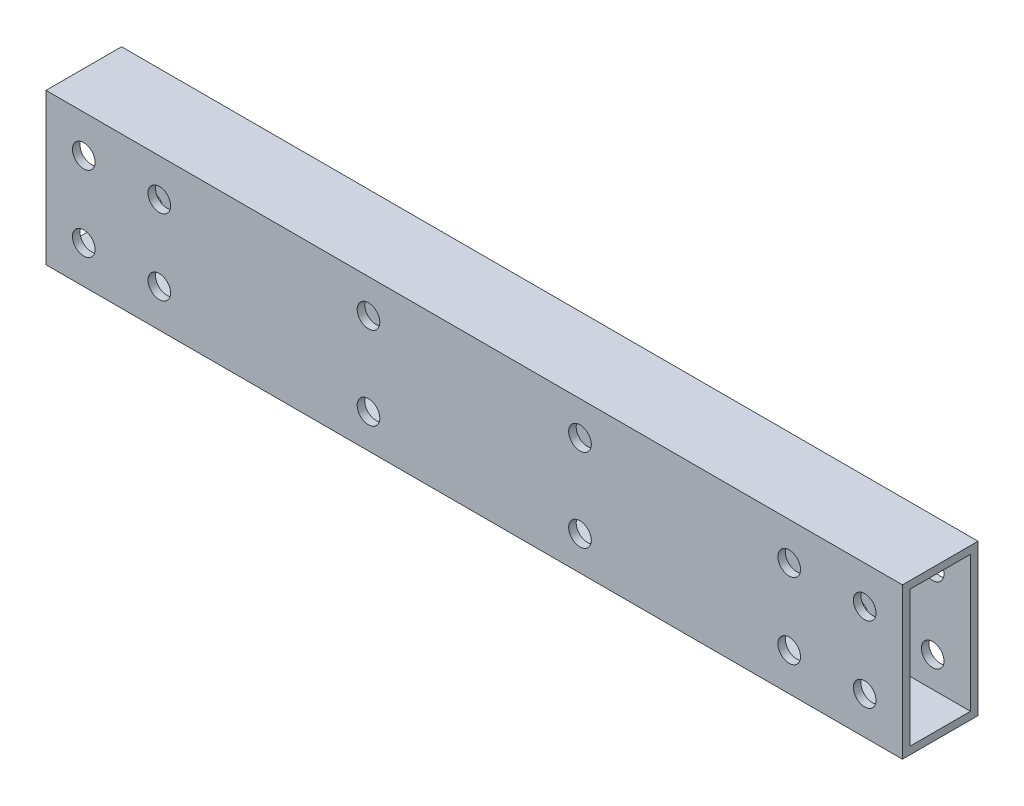
ISO-10303-21;
HEADER;
FILE_DESCRIPTION(('STEP AP214'),'2;1');
FILE_NAME('part.step','',(''),(''),'','','');
FILE_SCHEMA(('AUTOMOTIVE_DESIGN { 1 0 10303 214 1 1 1 1 }'));
ENDSEC;
DATA;
#1=APPLICATION_CONTEXT('core data for automotive mechanical design processes');
#2=APPLICATION_PROTOCOL_DEFINITION('international standard','automotive_design',2000,#1);
#3=PRODUCT_CONTEXT('',#1,'mechanical');
#4=PRODUCT('Part','Part','',(#3));
#5=PRODUCT_RELATED_PRODUCT_CATEGORY('part','',(#4));
#6=PRODUCT_DEFINITION_FORMATION('','',#4);
#7=PRODUCT_DEFINITION_CONTEXT('part definition',#1,'design');
#8=PRODUCT_DEFINITION('design','',#6,#7);
#9=PRODUCT_DEFINITION_SHAPE('','',#8);
#10=(LENGTH_UNIT() NAMED_UNIT(*) SI_UNIT(.MILLI.,.METRE.));
#11=(NAMED_UNIT(*) PLANE_ANGLE_UNIT() SI_UNIT($,.RADIAN.));
#12=(NAMED_UNIT(*) SI_UNIT($,.STERADIAN.) SOLID_ANGLE_UNIT());
#13=UNCERTAINTY_MEASURE_WITH_UNIT(LENGTH_MEASURE(1.E-05),#10,'distance_accuracy_value','');
#14=(GEOMETRIC_REPRESENTATION_CONTEXT(3) GLOBAL_UNCERTAINTY_ASSIGNED_CONTEXT((#13)) GLOBAL_UNIT_ASSIGNED_CONTEXT((#10,
#11,#12)) REPRESENTATION_CONTEXT('',''));
#15=CARTESIAN_POINT('',(0.,0.,0.));
#16=DIRECTION('',(0.,0.,1.));
#17=DIRECTION('',(1.,0.,0.));
#18=AXIS2_PLACEMENT_3D('',#15,#16,#17);
#19=CARTESIAN_POINT('',(113.4,-10.,-5.));
#20=DIRECTION('',(0.,1.,0.));
#21=DIRECTION('',(0.,0.,1.));
#22=AXIS2_PLACEMENT_3D('',#19,#20,#21);
#23=PLANE('',#22);
#24=DIRECTION('',(0.,0.,-1.));
#25=VECTOR('',#24,1.);
#26=CARTESIAN_POINT('',(0.,-10.,-5.));
#27=LINE('',#26,#25);
#28=CARTESIAN_POINT('',(0.,-10.,5.));
#29=VERTEX_POINT('',#28);
#30=CARTESIAN_POINT('',(0.,-10.,-5.));
#31=VERTEX_POINT('',#30);
#32=EDGE_CURVE('E160',#29,#31,#27,.T.);
#33=ORIENTED_EDGE('',*,*,#32,.T.);
#34=DIRECTION('',(-1.,0.,0.));
#35=VECTOR('',#34,1.);
#36=CARTESIAN_POINT('',(113.4,-10.,-5.));
#37=LINE('',#36,#35);
#38=CARTESIAN_POINT('',(113.4,-10.,-5.));
#39=VERTEX_POINT('',#38);
#40=EDGE_CURVE('E12',#39,#31,#37,.T.);
#41=ORIENTED_EDGE('',*,*,#40,.F.);
#42=DIRECTION('',(0.,0.,-1.));
#43=VECTOR('',#42,1.);
#44=CARTESIAN_POINT('',(113.4,-10.,-5.));
#45=LINE('',#44,#43);
#46=CARTESIAN_POINT('',(113.4,-10.,5.));
#47=VERTEX_POINT('',#46);
#48=EDGE_CURVE('E133',#47,#39,#45,.T.);
#49=ORIENTED_EDGE('',*,*,#48,.F.);
#50=DIRECTION('',(-1.,0.,0.));
#51=VECTOR('',#50,1.);
#52=CARTESIAN_POINT('',(113.4,-10.,5.));
#53=LINE('',#52,#51);
#54=EDGE_CURVE('E167',#47,#29,#53,.T.);
#55=ORIENTED_EDGE('',*,*,#54,.T.);
#56=EDGE_LOOP('',(#33,#41,#49,#55));
#57=FACE_BOUND('',#56,.T.);
#58=ADVANCED_FACE('F52',(#57),#23,.F.);
#59=CARTESIAN_POINT('',(113.4,10.,-5.));
#60=DIRECTION('',(0.,0.,1.));
#61=DIRECTION('',(1.,0.,0.));
#62=AXIS2_PLACEMENT_3D('',#59,#60,#61);
#63=PLANE('',#62);
#64=CARTESIAN_POINT('',(42.7,-5.5,-5.));
#65=DIRECTION('',(0.,0.,1.));
#66=DIRECTION('',(-1.,0.,0.));
#67=AXIS2_PLACEMENT_3D('',#64,#65,#66);
#68=CIRCLE('',#67,1.49999999999998);
#69=CARTESIAN_POINT('',(41.2,-5.5,-5.));
#70=VERTEX_POINT('',#69);
#71=EDGE_CURVE('E329',#70,#70,#68,.T.);
#72=ORIENTED_EDGE('',*,*,#71,.T.);
#73=EDGE_LOOP('',(#72));
#74=FACE_BOUND('',#73,.T.);
#75=CARTESIAN_POINT('',(70.7,-5.5,-5.));
#76=DIRECTION('',(0.,0.,1.));
#77=DIRECTION('',(1.,0.,0.));
#78=AXIS2_PLACEMENT_3D('',#75,#76,#77);
#79=CIRCLE('',#78,1.50000000000005);
#80=CARTESIAN_POINT('',(72.2000000000001,-5.5,-5.));
#81=VERTEX_POINT('',#80);
#82=EDGE_CURVE('E335',#81,#81,#79,.T.);
#83=ORIENTED_EDGE('',*,*,#82,.T.);
#84=EDGE_LOOP('',(#83));
#85=FACE_BOUND('',#84,.T.);
#86=CARTESIAN_POINT('',(70.7,5.5,-5.));
#87=DIRECTION('',(0.,0.,1.));
#88=DIRECTION('',(-1.,0.,0.));
#89=AXIS2_PLACEMENT_3D('',#86,#87,#88);
#90=CIRCLE('',#89,1.5);
#91=CARTESIAN_POINT('',(69.2,5.5,-5.));
#92=VERTEX_POINT('',#91);
#93=EDGE_CURVE('E323',#92,#92,#90,.T.);
#94=ORIENTED_EDGE('',*,*,#93,.T.);
#95=EDGE_LOOP('',(#94));
#96=FACE_BOUND('',#95,.T.);
#97=CARTESIAN_POINT('',(42.7,5.5,-5.));
#98=DIRECTION('',(0.,0.,1.));
#99=DIRECTION('',(1.,0.,0.));
#100=AXIS2_PLACEMENT_3D('',#97,#98,#99);
#101=CIRCLE('',#100,1.5);
#102=CARTESIAN_POINT('',(44.2,5.5,-5.));
#103=VERTEX_POINT('',#102);
#104=EDGE_CURVE('E319',#103,#103,#101,.T.);
#105=ORIENTED_EDGE('',*,*,#104,.T.);
#106=EDGE_LOOP('',(#105));
#107=FACE_BOUND('',#106,.T.);
#108=CARTESIAN_POINT('',(108.4,-5.,-5.));
#109=DIRECTION('',(0.,0.,1.));
#110=DIRECTION('',(1.,0.,0.));
#111=AXIS2_PLACEMENT_3D('',#108,#109,#110);
#112=CIRCLE('',#111,1.50000000000001);
#113=CARTESIAN_POINT('',(109.9,-5.,-5.));
#114=VERTEX_POINT('',#113);
#115=EDGE_CURVE('E269',#114,#114,#112,.T.);
#116=ORIENTED_EDGE('',*,*,#115,.T.);
#117=EDGE_LOOP('',(#116));
#118=FACE_BOUND('',#117,.T.);
#119=CARTESIAN_POINT('',(5.,-5.,-5.));
#120=DIRECTION('',(0.,0.,1.));
#121=DIRECTION('',(1.,0.,0.));
#122=AXIS2_PLACEMENT_3D('',#119,#120,#121);
#123=CIRCLE('',#122,1.5);
#124=CARTESIAN_POINT('',(6.5,-5.,-5.));
#125=VERTEX_POINT('',#124);
#126=EDGE_CURVE('E258',#125,#125,#123,.T.);
#127=ORIENTED_EDGE('',*,*,#126,.T.);
#128=EDGE_LOOP('',(#127));
#129=FACE_BOUND('',#128,.T.);
#130=CARTESIAN_POINT('',(15.,-5.,-5.));
#131=DIRECTION('',(0.,0.,1.));
#132=DIRECTION('',(1.,0.,0.));
#133=AXIS2_PLACEMENT_3D('',#130,#131,#132);
#134=CIRCLE('',#133,1.5);
#135=CARTESIAN_POINT('',(16.5,-5.,-5.));
#136=VERTEX_POINT('',#135);
#137=EDGE_CURVE('E257',#136,#136,#134,.T.);
#138=ORIENTED_EDGE('',*,*,#137,.T.);
#139=EDGE_LOOP('',(#138));
#140=FACE_BOUND('',#139,.T.);
#141=CARTESIAN_POINT('',(5.,5.,-5.));
#142=DIRECTION('',(0.,0.,1.));
#143=DIRECTION('',(1.,0.,0.));
#144=AXIS2_PLACEMENT_3D('',#141,#142,#143);
#145=CIRCLE('',#144,1.5);
#146=CARTESIAN_POINT('',(6.5,5.,-5.));
#147=VERTEX_POINT('',#146);
#148=EDGE_CURVE('E251',#147,#147,#145,.T.);
#149=ORIENTED_EDGE('',*,*,#148,.T.);
#150=EDGE_LOOP('',(#149));
#151=FACE_BOUND('',#150,.T.);
#152=CARTESIAN_POINT('',(108.4,5.,-5.));
#153=DIRECTION('',(0.,0.,1.));
#154=DIRECTION('',(1.,0.,0.));
#155=AXIS2_PLACEMENT_3D('',#152,#153,#154);
#156=CIRCLE('',#155,1.50000000000001);
#157=CARTESIAN_POINT('',(109.9,5.,-5.));
#158=VERTEX_POINT('',#157);
#159=EDGE_CURVE('E270',#158,#158,#156,.T.);
#160=ORIENTED_EDGE('',*,*,#159,.T.);
#161=EDGE_LOOP('',(#160));
#162=FACE_BOUND('',#161,.T.);
#163=CARTESIAN_POINT('',(98.4,5.,-5.));
#164=DIRECTION('',(0.,0.,1.));
#165=DIRECTION('',(1.,0.,0.));
#166=AXIS2_PLACEMENT_3D('',#163,#164,#165);
#167=CIRCLE('',#166,1.5);
#168=CARTESIAN_POINT('',(99.9,5.,-5.));
#169=VERTEX_POINT('',#168);
#170=EDGE_CURVE('E288',#169,#169,#167,.T.);
#171=ORIENTED_EDGE('',*,*,#170,.T.);
#172=EDGE_LOOP('',(#171));
#173=FACE_BOUND('',#172,.T.);
#174=CARTESIAN_POINT('',(98.4,-5.,-5.));
#175=DIRECTION('',(0.,0.,1.));
#176=DIRECTION('',(1.,0.,0.));
#177=AXIS2_PLACEMENT_3D('',#174,#175,#176);
#178=CIRCLE('',#177,1.5);
#179=CARTESIAN_POINT('',(99.9,-5.,-5.));
#180=VERTEX_POINT('',#179);
#181=EDGE_CURVE('E281',#180,#180,#178,.T.);
#182=ORIENTED_EDGE('',*,*,#181,.T.);
#183=EDGE_LOOP('',(#182));
#184=FACE_BOUND('',#183,.T.);
#185=CARTESIAN_POINT('',(15.,5.,-5.));
#186=DIRECTION('',(0.,0.,1.));
#187=DIRECTION('',(1.,0.,0.));
#188=AXIS2_PLACEMENT_3D('',#185,#186,#187);
#189=CIRCLE('',#188,1.5);
#190=CARTESIAN_POINT('',(16.5,5.,-5.));
#191=VERTEX_POINT('',#190);
#192=EDGE_CURVE('E247',#191,#191,#189,.T.);
#193=ORIENTED_EDGE('',*,*,#192,.T.);
#194=EDGE_LOOP('',(#193));
#195=FACE_BOUND('',#194,.T.);
#196=DIRECTION('',(0.,1.,0.));
#197=VECTOR('',#196,1.);
#198=CARTESIAN_POINT('',(0.,10.,-5.));
#199=LINE('',#198,#197);
#200=CARTESIAN_POINT('',(0.,10.,-5.));
#201=VERTEX_POINT('',#200);
#202=EDGE_CURVE('E138',#31,#201,#199,.T.);
#203=ORIENTED_EDGE('',*,*,#202,.T.);
#204=DIRECTION('',(-1.,0.,0.));
#205=VECTOR('',#204,1.);
#206=CARTESIAN_POINT('',(113.4,10.,-5.));
#207=LINE('',#206,#205);
#208=CARTESIAN_POINT('',(113.4,10.,-5.));
#209=VERTEX_POINT('',#208);
#210=EDGE_CURVE('E62',#209,#201,#207,.T.);
#211=ORIENTED_EDGE('',*,*,#210,.F.);
#212=DIRECTION('',(0.,1.,0.));
#213=VECTOR('',#212,1.);
#214=CARTESIAN_POINT('',(113.4,10.,-5.));
#215=LINE('',#214,#213);
#216=EDGE_CURVE('E127',#39,#209,#215,.T.);
#217=ORIENTED_EDGE('',*,*,#216,.F.);
#218=ORIENTED_EDGE('',*,*,#40,.T.);
#219=EDGE_LOOP('',(#203,#211,#217,#218));
#220=FACE_BOUND('',#219,.T.);
#221=ADVANCED_FACE('F137',(#74,#85,#96,#107,#118,#129,#140,#151,#162,#173,#184,#195,#220),#63,.F.);
#222=CARTESIAN_POINT('',(113.4,10.,-5.));
#223=DIRECTION('',(0.,-1.,0.));
#224=DIRECTION('',(0.,0.,-1.));
#225=AXIS2_PLACEMENT_3D('',#222,#223,#224);
#226=PLANE('',#225);
#227=DIRECTION('',(0.,0.,1.));
#228=VECTOR('',#227,1.);
#229=CARTESIAN_POINT('',(0.,10.,-5.));
#230=LINE('',#229,#228);
#231=CARTESIAN_POINT('',(0.,10.,5.));
#232=VERTEX_POINT('',#231);
#233=EDGE_CURVE('E100',#201,#232,#230,.T.);
#234=ORIENTED_EDGE('',*,*,#233,.T.);
#235=DIRECTION('',(-1.,0.,0.));
#236=VECTOR('',#235,1.);
#237=CARTESIAN_POINT('',(113.4,10.,5.));
#238=LINE('',#237,#236);
#239=CARTESIAN_POINT('',(113.4,10.,5.));
#240=VERTEX_POINT('',#239);
#241=EDGE_CURVE('E139',#240,#232,#238,.T.);
#242=ORIENTED_EDGE('',*,*,#241,.F.);
#243=DIRECTION('',(0.,0.,1.));
#244=VECTOR('',#243,1.);
#245=CARTESIAN_POINT('',(113.4,10.,-5.));
#246=LINE('',#245,#244);
#247=EDGE_CURVE('E131',#209,#240,#246,.T.);
#248=ORIENTED_EDGE('',*,*,#247,.F.);
#249=ORIENTED_EDGE('',*,*,#210,.T.);
#250=EDGE_LOOP('',(#234,#242,#248,#249));
#251=FACE_BOUND('',#250,.T.);
#252=ADVANCED_FACE('F141',(#251),#226,.F.);
#253=CARTESIAN_POINT('',(113.4,-8.99999999999999,-4.00000000000001));
#254=DIRECTION('',(0.,1.,0.));
#255=DIRECTION('',(0.,0.,1.));
#256=AXIS2_PLACEMENT_3D('',#253,#254,#255);
#257=PLANE('',#256);
#258=DIRECTION('',(0.,0.,-1.));
#259=VECTOR('',#258,1.);
#260=CARTESIAN_POINT('',(0.,-8.99999999999999,-4.00000000000001));
#261=LINE('',#260,#259);
#262=CARTESIAN_POINT('',(0.,-9.,3.99999999999999));
#263=VERTEX_POINT('',#262);
#264=CARTESIAN_POINT('',(0.,-8.99999999999999,-4.00000000000001));
#265=VERTEX_POINT('',#264);
#266=EDGE_CURVE('E147',#263,#265,#261,.T.);
#267=ORIENTED_EDGE('',*,*,#266,.F.);
#268=DIRECTION('',(-1.,0.,0.));
#269=VECTOR('',#268,1.);
#270=CARTESIAN_POINT('',(113.4,-9.,3.99999999999999));
#271=LINE('',#270,#269);
#272=CARTESIAN_POINT('',(113.4,-9.,3.99999999999999));
#273=VERTEX_POINT('',#272);
#274=EDGE_CURVE('E56',#273,#263,#271,.T.);
#275=ORIENTED_EDGE('',*,*,#274,.F.);
#276=DIRECTION('',(0.,0.,-1.));
#277=VECTOR('',#276,1.);
#278=CARTESIAN_POINT('',(113.4,-8.99999999999999,-4.00000000000001));
#279=LINE('',#278,#277);
#280=CARTESIAN_POINT('',(113.4,-8.99999999999999,-4.00000000000001));
#281=VERTEX_POINT('',#280);
#282=EDGE_CURVE('E166',#273,#281,#279,.T.);
#283=ORIENTED_EDGE('',*,*,#282,.T.);
#284=DIRECTION('',(-1.,0.,0.));
#285=VECTOR('',#284,1.);
#286=CARTESIAN_POINT('',(113.4,-8.99999999999999,-4.00000000000001));
#287=LINE('',#286,#285);
#288=EDGE_CURVE('E143',#281,#265,#287,.T.);
#289=ORIENTED_EDGE('',*,*,#288,.T.);
#290=EDGE_LOOP('',(#267,#275,#283,#289));
#291=FACE_BOUND('',#290,.T.);
#292=ADVANCED_FACE('F54',(#291),#257,.T.);
#293=CARTESIAN_POINT('',(113.4,9.,4.));
#294=DIRECTION('',(0.,0.,-1.));
#295=DIRECTION('',(0.,1.,0.));
#296=AXIS2_PLACEMENT_3D('',#293,#294,#295);
#297=PLANE('',#296);
#298=CARTESIAN_POINT('',(42.7,-5.5,3.99999999999999));
#299=DIRECTION('',(0.,0.,-1.));
#300=DIRECTION('',(0.,1.,0.));
#301=AXIS2_PLACEMENT_3D('',#298,#299,#300);
#302=CIRCLE('',#301,1.49999999999998);
#303=CARTESIAN_POINT('',(42.7,-4.00000000000002,3.99999999999999));
#304=VERTEX_POINT('',#303);
#305=EDGE_CURVE('E282',#304,#304,#302,.T.);
#306=ORIENTED_EDGE('',*,*,#305,.F.);
#307=EDGE_LOOP('',(#306));
#308=FACE_BOUND('',#307,.T.);
#309=CARTESIAN_POINT('',(70.7,-5.5,3.99999999999999));
#310=DIRECTION('',(0.,0.,-1.));
#311=DIRECTION('',(0.,1.,0.));
#312=AXIS2_PLACEMENT_3D('',#309,#310,#311);
#313=CIRCLE('',#312,1.50000000000005);
#314=CARTESIAN_POINT('',(70.7,-3.99999999999995,3.99999999999999));
#315=VERTEX_POINT('',#314);
#316=EDGE_CURVE('E301',#315,#315,#313,.T.);
#317=ORIENTED_EDGE('',*,*,#316,.F.);
#318=EDGE_LOOP('',(#317));
#319=FACE_BOUND('',#318,.T.);
#320=CARTESIAN_POINT('',(70.7,5.5,4.));
#321=DIRECTION('',(0.,0.,-1.));
#322=DIRECTION('',(0.,1.,0.));
#323=AXIS2_PLACEMENT_3D('',#320,#321,#322);
#324=CIRCLE('',#323,1.5);
#325=CARTESIAN_POINT('',(70.7,7.,4.));
#326=VERTEX_POINT('',#325);
#327=EDGE_CURVE('E307',#326,#326,#324,.T.);
#328=ORIENTED_EDGE('',*,*,#327,.F.);
#329=EDGE_LOOP('',(#328));
#330=FACE_BOUND('',#329,.T.);
#331=CARTESIAN_POINT('',(42.7,5.5,4.));
#332=DIRECTION('',(0.,0.,-1.));
#333=DIRECTION('',(0.,1.,0.));
#334=AXIS2_PLACEMENT_3D('',#331,#332,#333);
#335=CIRCLE('',#334,1.5);
#336=CARTESIAN_POINT('',(42.7,7.,4.));
#337=VERTEX_POINT('',#336);
#338=EDGE_CURVE('E313',#337,#337,#335,.T.);
#339=ORIENTED_EDGE('',*,*,#338,.F.);
#340=EDGE_LOOP('',(#339));
#341=FACE_BOUND('',#340,.T.);
#342=CARTESIAN_POINT('',(108.4,-5.,3.99999999999999));
#343=DIRECTION('',(0.,0.,-1.));
#344=DIRECTION('',(0.,1.,0.));
#345=AXIS2_PLACEMENT_3D('',#342,#343,#344);
#346=CIRCLE('',#345,1.50000000000001);
#347=CARTESIAN_POINT('',(108.4,-3.49999999999999,3.99999999999999));
#348=VERTEX_POINT('',#347);
#349=EDGE_CURVE('E151',#348,#348,#346,.T.);
#350=ORIENTED_EDGE('',*,*,#349,.F.);
#351=EDGE_LOOP('',(#350));
#352=FACE_BOUND('',#351,.T.);
#353=CARTESIAN_POINT('',(5.,-5.,3.99999999999999));
#354=DIRECTION('',(0.,0.,-1.));
#355=DIRECTION('',(0.,1.,0.));
#356=AXIS2_PLACEMENT_3D('',#353,#354,#355);
#357=CIRCLE('',#356,1.5);
#358=CARTESIAN_POINT('',(5.,-3.5,3.99999999999999));
#359=VERTEX_POINT('',#358);
#360=EDGE_CURVE('E205',#359,#359,#357,.T.);
#361=ORIENTED_EDGE('',*,*,#360,.F.);
#362=EDGE_LOOP('',(#361));
#363=FACE_BOUND('',#362,.T.);
#364=CARTESIAN_POINT('',(15.,-5.,3.99999999999999));
#365=DIRECTION('',(0.,0.,-1.));
#366=DIRECTION('',(0.,1.,0.));
#367=AXIS2_PLACEMENT_3D('',#364,#365,#366);
#368=CIRCLE('',#367,1.5);
#369=CARTESIAN_POINT('',(15.,-3.5,3.99999999999999));
#370=VERTEX_POINT('',#369);
#371=EDGE_CURVE('E211',#370,#370,#368,.T.);
#372=ORIENTED_EDGE('',*,*,#371,.F.);
#373=EDGE_LOOP('',(#372));
#374=FACE_BOUND('',#373,.T.);
#375=CARTESIAN_POINT('',(5.,5.,4.));
#376=DIRECTION('',(0.,0.,-1.));
#377=DIRECTION('',(0.,1.,0.));
#378=AXIS2_PLACEMENT_3D('',#375,#376,#377);
#379=CIRCLE('',#378,1.5);
#380=CARTESIAN_POINT('',(5.,6.5,4.));
#381=VERTEX_POINT('',#380);
#382=EDGE_CURVE('E217',#381,#381,#379,.T.);
#383=ORIENTED_EDGE('',*,*,#382,.F.);
#384=EDGE_LOOP('',(#383));
#385=FACE_BOUND('',#384,.T.);
#386=CARTESIAN_POINT('',(108.4,5.,4.));
#387=DIRECTION('',(0.,0.,-1.));
#388=DIRECTION('',(0.,1.,0.));
#389=AXIS2_PLACEMENT_3D('',#386,#387,#388);
#390=CIRCLE('',#389,1.50000000000001);
#391=CARTESIAN_POINT('',(108.4,6.50000000000001,4.));
#392=VERTEX_POINT('',#391);
#393=EDGE_CURVE('E223',#392,#392,#390,.T.);
#394=ORIENTED_EDGE('',*,*,#393,.F.);
#395=EDGE_LOOP('',(#394));
#396=FACE_BOUND('',#395,.T.);
#397=CARTESIAN_POINT('',(98.4,5.,4.));
#398=DIRECTION('',(0.,0.,-1.));
#399=DIRECTION('',(0.,1.,0.));
#400=AXIS2_PLACEMENT_3D('',#397,#398,#399);
#401=CIRCLE('',#400,1.5);
#402=CARTESIAN_POINT('',(98.4,6.5,4.));
#403=VERTEX_POINT('',#402);
#404=EDGE_CURVE('E229',#403,#403,#401,.T.);
#405=ORIENTED_EDGE('',*,*,#404,.F.);
#406=EDGE_LOOP('',(#405));
#407=FACE_BOUND('',#406,.T.);
#408=CARTESIAN_POINT('',(98.4,-5.,3.99999999999999));
#409=DIRECTION('',(0.,0.,-1.));
#410=DIRECTION('',(0.,1.,0.));
#411=AXIS2_PLACEMENT_3D('',#408,#409,#410);
#412=CIRCLE('',#411,1.5);
#413=CARTESIAN_POINT('',(98.4,-3.5,3.99999999999999));
#414=VERTEX_POINT('',#413);
#415=EDGE_CURVE('E235',#414,#414,#412,.T.);
#416=ORIENTED_EDGE('',*,*,#415,.F.);
#417=EDGE_LOOP('',(#416));
#418=FACE_BOUND('',#417,.T.);
#419=CARTESIAN_POINT('',(15.,5.,4.));
#420=DIRECTION('',(0.,0.,-1.));
#421=DIRECTION('',(0.,1.,0.));
#422=AXIS2_PLACEMENT_3D('',#419,#420,#421);
#423=CIRCLE('',#422,1.5);
#424=CARTESIAN_POINT('',(15.,6.5,4.));
#425=VERTEX_POINT('',#424);
#426=EDGE_CURVE('E241',#425,#425,#423,.T.);
#427=ORIENTED_EDGE('',*,*,#426,.F.);
#428=EDGE_LOOP('',(#427));
#429=FACE_BOUND('',#428,.T.);
#430=DIRECTION('',(0.,-1.,0.));
#431=VECTOR('',#430,1.);
#432=CARTESIAN_POINT('',(0.,9.,4.));
#433=LINE('',#432,#431);
#434=CARTESIAN_POINT('',(0.,9.,4.));
#435=VERTEX_POINT('',#434);
#436=EDGE_CURVE('E150',#435,#263,#433,.T.);
#437=ORIENTED_EDGE('',*,*,#436,.F.);
#438=DIRECTION('',(-1.,0.,0.));
#439=VECTOR('',#438,1.);
#440=CARTESIAN_POINT('',(113.4,9.,4.));
#441=LINE('',#440,#439);
#442=CARTESIAN_POINT('',(113.4,9.,4.));
#443=VERTEX_POINT('',#442);
#444=EDGE_CURVE('E172',#443,#435,#441,.T.);
#445=ORIENTED_EDGE('',*,*,#444,.F.);
#446=DIRECTION('',(0.,-1.,0.));
#447=VECTOR('',#446,1.);
#448=CARTESIAN_POINT('',(113.4,9.,4.));
#449=LINE('',#448,#447);
#450=EDGE_CURVE('E181',#443,#273,#449,.T.);
#451=ORIENTED_EDGE('',*,*,#450,.T.);
#452=ORIENTED_EDGE('',*,*,#274,.T.);
#453=EDGE_LOOP('',(#437,#445,#451,#452));
#454=FACE_BOUND('',#453,.T.);
#455=ADVANCED_FACE('F179',(#308,#319,#330,#341,#352,#363,#374,#385,#396,#407,#418,#429,#454),
#297,.T.);
#456=CARTESIAN_POINT('',(113.4,9.,-4.));
#457=DIRECTION('',(0.,-1.,0.));
#458=DIRECTION('',(0.,0.,-1.));
#459=AXIS2_PLACEMENT_3D('',#456,#457,#458);
#460=PLANE('',#459);
#461=DIRECTION('',(0.,0.,1.));
#462=VECTOR('',#461,1.);
#463=CARTESIAN_POINT('',(0.,9.,-4.));
#464=LINE('',#463,#462);
#465=CARTESIAN_POINT('',(0.,9.,-4.));
#466=VERTEX_POINT('',#465);
#467=EDGE_CURVE('E154',#466,#435,#464,.T.);
#468=ORIENTED_EDGE('',*,*,#467,.F.);
#469=DIRECTION('',(-1.,0.,0.));
#470=VECTOR('',#469,1.);
#471=CARTESIAN_POINT('',(113.4,9.,-4.));
#472=LINE('',#471,#470);
#473=CARTESIAN_POINT('',(113.4,9.,-4.));
#474=VERTEX_POINT('',#473);
#475=EDGE_CURVE('E171',#474,#466,#472,.T.);
#476=ORIENTED_EDGE('',*,*,#475,.F.);
#477=DIRECTION('',(0.,0.,1.));
#478=VECTOR('',#477,1.);
#479=CARTESIAN_POINT('',(113.4,9.,-4.));
#480=LINE('',#479,#478);
#481=EDGE_CURVE('E188',#474,#443,#480,.T.);
#482=ORIENTED_EDGE('',*,*,#481,.T.);
#483=ORIENTED_EDGE('',*,*,#444,.T.);
#484=EDGE_LOOP('',(#468,#476,#482,#483));
#485=FACE_BOUND('',#484,.T.);
#486=ADVANCED_FACE('F186',(#485),#460,.T.);
#487=CARTESIAN_POINT('',(113.4,9.,-4.));
#488=DIRECTION('',(0.,0.,1.));
#489=DIRECTION('',(0.,-1.,0.));
#490=AXIS2_PLACEMENT_3D('',#487,#488,#489);
#491=PLANE('',#490);
#492=CARTESIAN_POINT('',(42.7,-5.5,-4.00000000000001));
#493=DIRECTION('',(0.,0.,1.));
#494=DIRECTION('',(0.,-1.,0.));
#495=AXIS2_PLACEMENT_3D('',#492,#493,#494);
#496=CIRCLE('',#495,1.49999999999998);
#497=CARTESIAN_POINT('',(42.7,-6.99999999999998,-4.00000000000001));
#498=VERTEX_POINT('',#497);
#499=EDGE_CURVE('E298',#498,#498,#496,.T.);
#500=ORIENTED_EDGE('',*,*,#499,.F.);
#501=EDGE_LOOP('',(#500));
#502=FACE_BOUND('',#501,.T.);
#503=CARTESIAN_POINT('',(70.7,-5.5,-4.00000000000001));
#504=DIRECTION('',(0.,0.,1.));
#505=DIRECTION('',(0.,-1.,0.));
#506=AXIS2_PLACEMENT_3D('',#503,#504,#505);
#507=CIRCLE('',#506,1.50000000000005);
#508=CARTESIAN_POINT('',(70.7,-7.00000000000005,-4.00000000000001));
#509=VERTEX_POINT('',#508);
#510=EDGE_CURVE('E304',#509,#509,#507,.T.);
#511=ORIENTED_EDGE('',*,*,#510,.F.);
#512=EDGE_LOOP('',(#511));
#513=FACE_BOUND('',#512,.T.);
#514=CARTESIAN_POINT('',(70.7,5.5,-4.));
#515=DIRECTION('',(0.,0.,1.));
#516=DIRECTION('',(0.,-1.,0.));
#517=AXIS2_PLACEMENT_3D('',#514,#515,#516);
#518=CIRCLE('',#517,1.5);
#519=CARTESIAN_POINT('',(70.7,4.,-4.));
#520=VERTEX_POINT('',#519);
#521=EDGE_CURVE('E310',#520,#520,#518,.T.);
#522=ORIENTED_EDGE('',*,*,#521,.F.);
#523=EDGE_LOOP('',(#522));
#524=FACE_BOUND('',#523,.T.);
#525=CARTESIAN_POINT('',(42.7,5.5,-4.));
#526=DIRECTION('',(0.,0.,1.));
#527=DIRECTION('',(0.,-1.,0.));
#528=AXIS2_PLACEMENT_3D('',#525,#526,#527);
#529=CIRCLE('',#528,1.5);
#530=CARTESIAN_POINT('',(42.7,4.,-4.));
#531=VERTEX_POINT('',#530);
#532=EDGE_CURVE('E316',#531,#531,#529,.T.);
#533=ORIENTED_EDGE('',*,*,#532,.F.);
#534=EDGE_LOOP('',(#533));
#535=FACE_BOUND('',#534,.T.);
#536=CARTESIAN_POINT('',(108.4,-5.,-4.00000000000001));
#537=DIRECTION('',(0.,0.,1.));
#538=DIRECTION('',(0.,-1.,0.));
#539=AXIS2_PLACEMENT_3D('',#536,#537,#538);
#540=CIRCLE('',#539,1.50000000000001);
#541=CARTESIAN_POINT('',(108.4,-6.50000000000001,-4.00000000000001));
#542=VERTEX_POINT('',#541);
#543=EDGE_CURVE('E202',#542,#542,#540,.T.);
#544=ORIENTED_EDGE('',*,*,#543,.F.);
#545=EDGE_LOOP('',(#544));
#546=FACE_BOUND('',#545,.T.);
#547=CARTESIAN_POINT('',(5.,-5.,-4.00000000000001));
#548=DIRECTION('',(0.,0.,1.));
#549=DIRECTION('',(0.,-1.,0.));
#550=AXIS2_PLACEMENT_3D('',#547,#548,#549);
#551=CIRCLE('',#550,1.5);
#552=CARTESIAN_POINT('',(5.,-6.5,-4.00000000000001));
#553=VERTEX_POINT('',#552);
#554=EDGE_CURVE('E208',#553,#553,#551,.T.);
#555=ORIENTED_EDGE('',*,*,#554,.F.);
#556=EDGE_LOOP('',(#555));
#557=FACE_BOUND('',#556,.T.);
#558=CARTESIAN_POINT('',(15.,-5.,-4.00000000000001));
#559=DIRECTION('',(0.,0.,1.));
#560=DIRECTION('',(0.,-1.,0.));
#561=AXIS2_PLACEMENT_3D('',#558,#559,#560);
#562=CIRCLE('',#561,1.5);
#563=CARTESIAN_POINT('',(15.,-6.5,-4.00000000000001));
#564=VERTEX_POINT('',#563);
#565=EDGE_CURVE('E214',#564,#564,#562,.T.);
#566=ORIENTED_EDGE('',*,*,#565,.F.);
#567=EDGE_LOOP('',(#566));
#568=FACE_BOUND('',#567,.T.);
#569=CARTESIAN_POINT('',(5.,5.,-4.));
#570=DIRECTION('',(0.,0.,1.));
#571=DIRECTION('',(0.,-1.,0.));
#572=AXIS2_PLACEMENT_3D('',#569,#570,#571);
#573=CIRCLE('',#572,1.5);
#574=CARTESIAN_POINT('',(5.,3.5,-4.));
#575=VERTEX_POINT('',#574);
#576=EDGE_CURVE('E220',#575,#575,#573,.T.);
#577=ORIENTED_EDGE('',*,*,#576,.F.);
#578=EDGE_LOOP('',(#577));
#579=FACE_BOUND('',#578,.T.);
#580=CARTESIAN_POINT('',(108.4,5.,-4.));
#581=DIRECTION('',(0.,0.,1.));
#582=DIRECTION('',(0.,-1.,0.));
#583=AXIS2_PLACEMENT_3D('',#580,#581,#582);
#584=CIRCLE('',#583,1.50000000000001);
#585=CARTESIAN_POINT('',(108.4,3.49999999999999,-4.));
#586=VERTEX_POINT('',#585);
#587=EDGE_CURVE('E226',#586,#586,#584,.T.);
#588=ORIENTED_EDGE('',*,*,#587,.F.);
#589=EDGE_LOOP('',(#588));
#590=FACE_BOUND('',#589,.T.);
#591=CARTESIAN_POINT('',(98.4,5.,-4.));
#592=DIRECTION('',(0.,0.,1.));
#593=DIRECTION('',(0.,-1.,0.));
#594=AXIS2_PLACEMENT_3D('',#591,#592,#593);
#595=CIRCLE('',#594,1.5);
#596=CARTESIAN_POINT('',(98.4,3.5,-4.));
#597=VERTEX_POINT('',#596);
#598=EDGE_CURVE('E232',#597,#597,#595,.T.);
#599=ORIENTED_EDGE('',*,*,#598,.F.);
#600=EDGE_LOOP('',(#599));
#601=FACE_BOUND('',#600,.T.);
#602=CARTESIAN_POINT('',(98.4,-5.,-4.00000000000001));
#603=DIRECTION('',(0.,0.,1.));
#604=DIRECTION('',(0.,-1.,0.));
#605=AXIS2_PLACEMENT_3D('',#602,#603,#604);
#606=CIRCLE('',#605,1.5);
#607=CARTESIAN_POINT('',(98.4,-6.5,-4.00000000000001));
#608=VERTEX_POINT('',#607);
#609=EDGE_CURVE('E238',#608,#608,#606,.T.);
#610=ORIENTED_EDGE('',*,*,#609,.F.);
#611=EDGE_LOOP('',(#610));
#612=FACE_BOUND('',#611,.T.);
#613=CARTESIAN_POINT('',(15.,5.,-4.));
#614=DIRECTION('',(0.,0.,1.));
#615=DIRECTION('',(0.,-1.,0.));
#616=AXIS2_PLACEMENT_3D('',#613,#614,#615);
#617=CIRCLE('',#616,1.5);
#618=CARTESIAN_POINT('',(15.,3.5,-4.));
#619=VERTEX_POINT('',#618);
#620=EDGE_CURVE('E244',#619,#619,#617,.T.);
#621=ORIENTED_EDGE('',*,*,#620,.F.);
#622=EDGE_LOOP('',(#621));
#623=FACE_BOUND('',#622,.T.);
#624=DIRECTION('',(0.,1.,0.));
#625=VECTOR('',#624,1.);
#626=CARTESIAN_POINT('',(0.,9.,-4.));
#627=LINE('',#626,#625);
#628=EDGE_CURVE('E157',#265,#466,#627,.T.);
#629=ORIENTED_EDGE('',*,*,#628,.F.);
#630=ORIENTED_EDGE('',*,*,#288,.F.);
#631=DIRECTION('',(0.,1.,0.));
#632=VECTOR('',#631,1.);
#633=CARTESIAN_POINT('',(113.4,9.,-4.));
#634=LINE('',#633,#632);
#635=EDGE_CURVE('E193',#281,#474,#634,.T.);
#636=ORIENTED_EDGE('',*,*,#635,.T.);
#637=ORIENTED_EDGE('',*,*,#475,.T.);
#638=EDGE_LOOP('',(#629,#630,#636,#637));
#639=FACE_BOUND('',#638,.T.);
#640=ADVANCED_FACE('F195',(#502,#513,#524,#535,#546,#557,#568,#579,#590,#601,#612,#623,#639),
#491,.T.);
#641=CARTESIAN_POINT('',(113.4,10.,5.));
#642=DIRECTION('',(0.,0.,-1.));
#643=DIRECTION('',(-1.,0.,0.));
#644=AXIS2_PLACEMENT_3D('',#641,#642,#643);
#645=PLANE('',#644);
#646=CARTESIAN_POINT('',(42.7,-5.5,5.));
#647=DIRECTION('',(0.,0.,1.));
#648=DIRECTION('',(-1.,0.,0.));
#649=AXIS2_PLACEMENT_3D('',#646,#647,#648);
#650=CIRCLE('',#649,1.49999999999998);
#651=CARTESIAN_POINT('',(41.2,-5.5,5.));
#652=VERTEX_POINT('',#651);
#653=EDGE_CURVE('E326',#652,#652,#650,.T.);
#654=ORIENTED_EDGE('',*,*,#653,.F.);
#655=EDGE_LOOP('',(#654));
#656=FACE_BOUND('',#655,.T.);
#657=CARTESIAN_POINT('',(70.7,-5.5,5.));
#658=DIRECTION('',(0.,0.,1.));
#659=DIRECTION('',(1.,0.,0.));
#660=AXIS2_PLACEMENT_3D('',#657,#658,#659);
#661=CIRCLE('',#660,1.50000000000005);
#662=CARTESIAN_POINT('',(72.2000000000001,-5.5,5.));
#663=VERTEX_POINT('',#662);
#664=EDGE_CURVE('E332',#663,#663,#661,.T.);
#665=ORIENTED_EDGE('',*,*,#664,.F.);
#666=EDGE_LOOP('',(#665));
#667=FACE_BOUND('',#666,.T.);
#668=CARTESIAN_POINT('',(70.7,5.5,5.));
#669=DIRECTION('',(0.,0.,1.));
#670=DIRECTION('',(-1.,0.,0.));
#671=AXIS2_PLACEMENT_3D('',#668,#669,#670);
#672=CIRCLE('',#671,1.5);
#673=CARTESIAN_POINT('',(69.2,5.5,5.));
#674=VERTEX_POINT('',#673);
#675=EDGE_CURVE('E338',#674,#674,#672,.T.);
#676=ORIENTED_EDGE('',*,*,#675,.F.);
#677=EDGE_LOOP('',(#676));
#678=FACE_BOUND('',#677,.T.);
#679=CARTESIAN_POINT('',(42.7,5.5,5.));
#680=DIRECTION('',(0.,0.,1.));
#681=DIRECTION('',(1.,0.,0.));
#682=AXIS2_PLACEMENT_3D('',#679,#680,#681);
#683=CIRCLE('',#682,1.5);
#684=CARTESIAN_POINT('',(44.2,5.5,5.));
#685=VERTEX_POINT('',#684);
#686=EDGE_CURVE('E320',#685,#685,#683,.T.);
#687=ORIENTED_EDGE('',*,*,#686,.F.);
#688=EDGE_LOOP('',(#687));
#689=FACE_BOUND('',#688,.T.);
#690=CARTESIAN_POINT('',(108.4,-5.,5.));
#691=DIRECTION('',(0.,0.,1.));
#692=DIRECTION('',(1.,0.,0.));
#693=AXIS2_PLACEMENT_3D('',#690,#691,#692);
#694=CIRCLE('',#693,1.50000000000001);
#695=CARTESIAN_POINT('',(109.9,-5.,5.));
#696=VERTEX_POINT('',#695);
#697=EDGE_CURVE('E266',#696,#696,#694,.T.);
#698=ORIENTED_EDGE('',*,*,#697,.F.);
#699=EDGE_LOOP('',(#698));
#700=FACE_BOUND('',#699,.T.);
#701=CARTESIAN_POINT('',(5.,-5.,5.));
#702=DIRECTION('',(0.,0.,1.));
#703=DIRECTION('',(1.,0.,0.));
#704=AXIS2_PLACEMENT_3D('',#701,#702,#703);
#705=CIRCLE('',#704,1.5);
#706=CARTESIAN_POINT('',(6.5,-5.,5.));
#707=VERTEX_POINT('',#706);
#708=EDGE_CURVE('E273',#707,#707,#705,.T.);
#709=ORIENTED_EDGE('',*,*,#708,.F.);
#710=EDGE_LOOP('',(#709));
#711=FACE_BOUND('',#710,.T.);
#712=CARTESIAN_POINT('',(15.,-5.,5.));
#713=DIRECTION('',(0.,0.,1.));
#714=DIRECTION('',(1.,0.,0.));
#715=AXIS2_PLACEMENT_3D('',#712,#713,#714);
#716=CIRCLE('',#715,1.5);
#717=CARTESIAN_POINT('',(16.5,-5.,5.));
#718=VERTEX_POINT('',#717);
#719=EDGE_CURVE('E254',#718,#718,#716,.T.);
#720=ORIENTED_EDGE('',*,*,#719,.F.);
#721=EDGE_LOOP('',(#720));
#722=FACE_BOUND('',#721,.T.);
#723=CARTESIAN_POINT('',(5.,5.,5.));
#724=DIRECTION('',(0.,0.,1.));
#725=DIRECTION('',(1.,0.,0.));
#726=AXIS2_PLACEMENT_3D('',#723,#724,#725);
#727=CIRCLE('',#726,1.5);
#728=CARTESIAN_POINT('',(6.5,5.,5.));
#729=VERTEX_POINT('',#728);
#730=EDGE_CURVE('E261',#729,#729,#727,.T.);
#731=ORIENTED_EDGE('',*,*,#730,.F.);
#732=EDGE_LOOP('',(#731));
#733=FACE_BOUND('',#732,.T.);
#734=CARTESIAN_POINT('',(108.4,5.,5.));
#735=DIRECTION('',(0.,0.,1.));
#736=DIRECTION('',(1.,0.,0.));
#737=AXIS2_PLACEMENT_3D('',#734,#735,#736);
#738=CIRCLE('',#737,1.50000000000001);
#739=CARTESIAN_POINT('',(109.9,5.,5.));
#740=VERTEX_POINT('',#739);
#741=EDGE_CURVE('E291',#740,#740,#738,.T.);
#742=ORIENTED_EDGE('',*,*,#741,.F.);
#743=EDGE_LOOP('',(#742));
#744=FACE_BOUND('',#743,.T.);
#745=CARTESIAN_POINT('',(98.4,5.,5.));
#746=DIRECTION('',(0.,0.,1.));
#747=DIRECTION('',(1.,0.,0.));
#748=AXIS2_PLACEMENT_3D('',#745,#746,#747);
#749=CIRCLE('',#748,1.5);
#750=CARTESIAN_POINT('',(99.9,5.,5.));
#751=VERTEX_POINT('',#750);
#752=EDGE_CURVE('E285',#751,#751,#749,.T.);
#753=ORIENTED_EDGE('',*,*,#752,.F.);
#754=EDGE_LOOP('',(#753));
#755=FACE_BOUND('',#754,.T.);
#756=CARTESIAN_POINT('',(98.4,-5.,5.));
#757=DIRECTION('',(0.,0.,1.));
#758=DIRECTION('',(1.,0.,0.));
#759=AXIS2_PLACEMENT_3D('',#756,#757,#758);
#760=CIRCLE('',#759,1.5);
#761=CARTESIAN_POINT('',(99.9,-5.,5.));
#762=VERTEX_POINT('',#761);
#763=EDGE_CURVE('E278',#762,#762,#760,.T.);
#764=ORIENTED_EDGE('',*,*,#763,.F.);
#765=EDGE_LOOP('',(#764));
#766=FACE_BOUND('',#765,.T.);
#767=CARTESIAN_POINT('',(15.,5.,5.));
#768=DIRECTION('',(0.,0.,1.));
#769=DIRECTION('',(1.,0.,0.));
#770=AXIS2_PLACEMENT_3D('',#767,#768,#769);
#771=CIRCLE('',#770,1.5);
#772=CARTESIAN_POINT('',(16.5,5.,5.));
#773=VERTEX_POINT('',#772);
#774=EDGE_CURVE('E248',#773,#773,#771,.T.);
#775=ORIENTED_EDGE('',*,*,#774,.F.);
#776=EDGE_LOOP('',(#775));
#777=FACE_BOUND('',#776,.T.);
#778=DIRECTION('',(0.,-1.,0.));
#779=VECTOR('',#778,1.);
#780=CARTESIAN_POINT('',(0.,10.,5.));
#781=LINE('',#780,#779);
#782=EDGE_CURVE('E106',#232,#29,#781,.T.);
#783=ORIENTED_EDGE('',*,*,#782,.T.);
#784=ORIENTED_EDGE('',*,*,#54,.F.);
#785=DIRECTION('',(0.,-1.,0.));
#786=VECTOR('',#785,1.);
#787=CARTESIAN_POINT('',(113.4,10.,5.));
#788=LINE('',#787,#786);
#789=EDGE_CURVE('E71',#240,#47,#788,.T.);
#790=ORIENTED_EDGE('',*,*,#789,.F.);
#791=ORIENTED_EDGE('',*,*,#241,.T.);
#792=EDGE_LOOP('',(#783,#784,#790,#791));
#793=FACE_BOUND('',#792,.T.);
#794=ADVANCED_FACE('F379',(#656,#667,#678,#689,#700,#711,#722,#733,#744,#755,#766,#777,#793),
#645,.F.);
#795=CARTESIAN_POINT('',(113.4,0.,0.));
#796=DIRECTION('',(1.,0.,0.));
#797=DIRECTION('',(0.,0.,-1.));
#798=AXIS2_PLACEMENT_3D('',#795,#796,#797);
#799=PLANE('',#798);
#800=ORIENTED_EDGE('',*,*,#282,.F.);
#801=ORIENTED_EDGE('',*,*,#450,.F.);
#802=ORIENTED_EDGE('',*,*,#481,.F.);
#803=ORIENTED_EDGE('',*,*,#635,.F.);
#804=EDGE_LOOP('',(#800,#801,#802,#803));
#805=FACE_BOUND('',#804,.T.);
#806=ORIENTED_EDGE('',*,*,#48,.T.);
#807=ORIENTED_EDGE('',*,*,#216,.T.);
#808=ORIENTED_EDGE('',*,*,#247,.T.);
#809=ORIENTED_EDGE('',*,*,#789,.T.);
#810=EDGE_LOOP('',(#806,#807,#808,#809));
#811=FACE_BOUND('',#810,.T.);
#812=ADVANCED_FACE('F129',(#805,#811),#799,.T.);
#813=CARTESIAN_POINT('',(0.,0.,0.));
#814=DIRECTION('',(1.,0.,0.));
#815=DIRECTION('',(0.,0.,-1.));
#816=AXIS2_PLACEMENT_3D('',#813,#814,#815);
#817=PLANE('',#816);
#818=ORIENTED_EDGE('',*,*,#266,.T.);
#819=ORIENTED_EDGE('',*,*,#628,.T.);
#820=ORIENTED_EDGE('',*,*,#467,.T.);
#821=ORIENTED_EDGE('',*,*,#436,.T.);
#822=EDGE_LOOP('',(#818,#819,#820,#821));
#823=FACE_BOUND('',#822,.T.);
#824=ORIENTED_EDGE('',*,*,#32,.F.);
#825=ORIENTED_EDGE('',*,*,#782,.F.);
#826=ORIENTED_EDGE('',*,*,#233,.F.);
#827=ORIENTED_EDGE('',*,*,#202,.F.);
#828=EDGE_LOOP('',(#824,#825,#826,#827));
#829=FACE_BOUND('',#828,.T.);
#830=ADVANCED_FACE('F184',(#823,#829),#817,.F.);
#831=CARTESIAN_POINT('',(15.,5.,-5.));
#832=DIRECTION('',(0.,0.,1.));
#833=DIRECTION('',(1.,0.,0.));
#834=AXIS2_PLACEMENT_3D('',#831,#832,#833);
#835=CYLINDRICAL_SURFACE('',#834,1.5);
#836=ORIENTED_EDGE('',*,*,#426,.T.);
#837=EDGE_LOOP('',(#836));
#838=FACE_BOUND('',#837,.T.);
#839=ORIENTED_EDGE('',*,*,#774,.T.);
#840=EDGE_LOOP('',(#839));
#841=FACE_BOUND('',#840,.T.);
#842=ADVANCED_FACE('F411',(#838,#841),#835,.F.);
#843=CARTESIAN_POINT('',(98.4,-5.,-5.));
#844=DIRECTION('',(0.,0.,1.));
#845=DIRECTION('',(1.,0.,0.));
#846=AXIS2_PLACEMENT_3D('',#843,#844,#845);
#847=CYLINDRICAL_SURFACE('',#846,1.5);
#848=ORIENTED_EDGE('',*,*,#415,.T.);
#849=EDGE_LOOP('',(#848));
#850=FACE_BOUND('',#849,.T.);
#851=ORIENTED_EDGE('',*,*,#763,.T.);
#852=EDGE_LOOP('',(#851));
#853=FACE_BOUND('',#852,.T.);
#854=ADVANCED_FACE('F414',(#850,#853),#847,.F.);
#855=CARTESIAN_POINT('',(98.4,5.,-5.));
#856=DIRECTION('',(0.,0.,1.));
#857=DIRECTION('',(1.,0.,0.));
#858=AXIS2_PLACEMENT_3D('',#855,#856,#857);
#859=CYLINDRICAL_SURFACE('',#858,1.5);
#860=ORIENTED_EDGE('',*,*,#404,.T.);
#861=EDGE_LOOP('',(#860));
#862=FACE_BOUND('',#861,.T.);
#863=ORIENTED_EDGE('',*,*,#752,.T.);
#864=EDGE_LOOP('',(#863));
#865=FACE_BOUND('',#864,.T.);
#866=ADVANCED_FACE('F479',(#862,#865),#859,.F.);
#867=CARTESIAN_POINT('',(108.4,5.,-5.));
#868=DIRECTION('',(0.,0.,1.));
#869=DIRECTION('',(1.,0.,0.));
#870=AXIS2_PLACEMENT_3D('',#867,#868,#869);
#871=CYLINDRICAL_SURFACE('',#870,1.50000000000001);
#872=ORIENTED_EDGE('',*,*,#393,.T.);
#873=EDGE_LOOP('',(#872));
#874=FACE_BOUND('',#873,.T.);
#875=ORIENTED_EDGE('',*,*,#741,.T.);
#876=EDGE_LOOP('',(#875));
#877=FACE_BOUND('',#876,.T.);
#878=ADVANCED_FACE('F490',(#874,#877),#871,.F.);
#879=CARTESIAN_POINT('',(5.,5.,-5.));
#880=DIRECTION('',(0.,0.,1.));
#881=DIRECTION('',(1.,0.,0.));
#882=AXIS2_PLACEMENT_3D('',#879,#880,#881);
#883=CYLINDRICAL_SURFACE('',#882,1.5);
#884=ORIENTED_EDGE('',*,*,#382,.T.);
#885=EDGE_LOOP('',(#884));
#886=FACE_BOUND('',#885,.T.);
#887=ORIENTED_EDGE('',*,*,#730,.T.);
#888=EDGE_LOOP('',(#887));
#889=FACE_BOUND('',#888,.T.);
#890=ADVANCED_FACE('F501',(#886,#889),#883,.F.);
#891=CARTESIAN_POINT('',(15.,-5.,-5.));
#892=DIRECTION('',(0.,0.,1.));
#893=DIRECTION('',(1.,0.,0.));
#894=AXIS2_PLACEMENT_3D('',#891,#892,#893);
#895=CYLINDRICAL_SURFACE('',#894,1.5);
#896=ORIENTED_EDGE('',*,*,#371,.T.);
#897=EDGE_LOOP('',(#896));
#898=FACE_BOUND('',#897,.T.);
#899=ORIENTED_EDGE('',*,*,#719,.T.);
#900=EDGE_LOOP('',(#899));
#901=FACE_BOUND('',#900,.T.);
#902=ADVANCED_FACE('F512',(#898,#901),#895,.F.);
#903=CARTESIAN_POINT('',(5.,-5.,-5.));
#904=DIRECTION('',(0.,0.,1.));
#905=DIRECTION('',(1.,0.,0.));
#906=AXIS2_PLACEMENT_3D('',#903,#904,#905);
#907=CYLINDRICAL_SURFACE('',#906,1.5);
#908=ORIENTED_EDGE('',*,*,#360,.T.);
#909=EDGE_LOOP('',(#908));
#910=FACE_BOUND('',#909,.T.);
#911=ORIENTED_EDGE('',*,*,#708,.T.);
#912=EDGE_LOOP('',(#911));
#913=FACE_BOUND('',#912,.T.);
#914=ADVANCED_FACE('F523',(#910,#913),#907,.F.);
#915=CARTESIAN_POINT('',(108.4,-5.,-5.));
#916=DIRECTION('',(0.,0.,1.));
#917=DIRECTION('',(1.,0.,0.));
#918=AXIS2_PLACEMENT_3D('',#915,#916,#917);
#919=CYLINDRICAL_SURFACE('',#918,1.50000000000001);
#920=ORIENTED_EDGE('',*,*,#349,.T.);
#921=EDGE_LOOP('',(#920));
#922=FACE_BOUND('',#921,.T.);
#923=ORIENTED_EDGE('',*,*,#697,.T.);
#924=EDGE_LOOP('',(#923));
#925=FACE_BOUND('',#924,.T.);
#926=ADVANCED_FACE('F534',(#922,#925),#919,.F.);
#927=ORIENTED_EDGE('',*,*,#620,.T.);
#928=EDGE_LOOP('',(#927));
#929=FACE_BOUND('',#928,.T.);
#930=ORIENTED_EDGE('',*,*,#192,.F.);
#931=EDGE_LOOP('',(#930));
#932=FACE_BOUND('',#931,.T.);
#933=ADVANCED_FACE('F416',(#929,#932),#835,.F.);
#934=ORIENTED_EDGE('',*,*,#609,.T.);
#935=EDGE_LOOP('',(#934));
#936=FACE_BOUND('',#935,.T.);
#937=ORIENTED_EDGE('',*,*,#181,.F.);
#938=EDGE_LOOP('',(#937));
#939=FACE_BOUND('',#938,.T.);
#940=ADVANCED_FACE('F482',(#936,#939),#847,.F.);
#941=ORIENTED_EDGE('',*,*,#598,.T.);
#942=EDGE_LOOP('',(#941));
#943=FACE_BOUND('',#942,.T.);
#944=ORIENTED_EDGE('',*,*,#170,.F.);
#945=EDGE_LOOP('',(#944));
#946=FACE_BOUND('',#945,.T.);
#947=ADVANCED_FACE('F493',(#943,#946),#859,.F.);
#948=ORIENTED_EDGE('',*,*,#587,.T.);
#949=EDGE_LOOP('',(#948));
#950=FACE_BOUND('',#949,.T.);
#951=ORIENTED_EDGE('',*,*,#159,.F.);
#952=EDGE_LOOP('',(#951));
#953=FACE_BOUND('',#952,.T.);
#954=ADVANCED_FACE('F504',(#950,#953),#871,.F.);
#955=ORIENTED_EDGE('',*,*,#576,.T.);
#956=EDGE_LOOP('',(#955));
#957=FACE_BOUND('',#956,.T.);
#958=ORIENTED_EDGE('',*,*,#148,.F.);
#959=EDGE_LOOP('',(#958));
#960=FACE_BOUND('',#959,.T.);
#961=ADVANCED_FACE('F515',(#957,#960),#883,.F.);
#962=ORIENTED_EDGE('',*,*,#565,.T.);
#963=EDGE_LOOP('',(#962));
#964=FACE_BOUND('',#963,.T.);
#965=ORIENTED_EDGE('',*,*,#137,.F.);
#966=EDGE_LOOP('',(#965));
#967=FACE_BOUND('',#966,.T.);
#968=ADVANCED_FACE('F526',(#964,#967),#895,.F.);
#969=ORIENTED_EDGE('',*,*,#554,.T.);
#970=EDGE_LOOP('',(#969));
#971=FACE_BOUND('',#970,.T.);
#972=ORIENTED_EDGE('',*,*,#126,.F.);
#973=EDGE_LOOP('',(#972));
#974=FACE_BOUND('',#973,.T.);
#975=ADVANCED_FACE('F537',(#971,#974),#907,.F.);
#976=ORIENTED_EDGE('',*,*,#543,.T.);
#977=EDGE_LOOP('',(#976));
#978=FACE_BOUND('',#977,.T.);
#979=ORIENTED_EDGE('',*,*,#115,.F.);
#980=EDGE_LOOP('',(#979));
#981=FACE_BOUND('',#980,.T.);
#982=ADVANCED_FACE('F547',(#978,#981),#919,.F.);
#983=CARTESIAN_POINT('',(42.7,5.5,-5.));
#984=DIRECTION('',(0.,0.,1.));
#985=DIRECTION('',(1.,0.,0.));
#986=AXIS2_PLACEMENT_3D('',#983,#984,#985);
#987=CYLINDRICAL_SURFACE('',#986,1.5);
#988=ORIENTED_EDGE('',*,*,#338,.T.);
#989=EDGE_LOOP('',(#988));
#990=FACE_BOUND('',#989,.T.);
#991=ORIENTED_EDGE('',*,*,#686,.T.);
#992=EDGE_LOOP('',(#991));
#993=FACE_BOUND('',#992,.T.);
#994=ADVANCED_FACE('F364',(#990,#993),#987,.F.);
#995=CARTESIAN_POINT('',(70.7,5.5,-5.));
#996=DIRECTION('',(0.,0.,1.));
#997=DIRECTION('',(1.,0.,0.));
#998=AXIS2_PLACEMENT_3D('',#995,#996,#997);
#999=CYLINDRICAL_SURFACE('',#998,1.5);
#1000=ORIENTED_EDGE('',*,*,#327,.T.);
#1001=EDGE_LOOP('',(#1000));
#1002=FACE_BOUND('',#1001,.T.);
#1003=ORIENTED_EDGE('',*,*,#675,.T.);
#1004=EDGE_LOOP('',(#1003));
#1005=FACE_BOUND('',#1004,.T.);
#1006=ADVANCED_FACE('F352',(#1002,#1005),#999,.F.);
#1007=CARTESIAN_POINT('',(70.7,-5.5,-5.));
#1008=DIRECTION('',(0.,0.,1.));
#1009=DIRECTION('',(1.,0.,0.));
#1010=AXIS2_PLACEMENT_3D('',#1007,#1008,#1009);
#1011=CYLINDRICAL_SURFACE('',#1010,1.50000000000005);
#1012=ORIENTED_EDGE('',*,*,#316,.T.);
#1013=EDGE_LOOP('',(#1012));
#1014=FACE_BOUND('',#1013,.T.);
#1015=ORIENTED_EDGE('',*,*,#664,.T.);
#1016=EDGE_LOOP('',(#1015));
#1017=FACE_BOUND('',#1016,.T.);
#1018=ADVANCED_FACE('F360',(#1014,#1017),#1011,.F.);
#1019=CARTESIAN_POINT('',(42.7,-5.5,-5.));
#1020=DIRECTION('',(0.,0.,1.));
#1021=DIRECTION('',(1.,0.,0.));
#1022=AXIS2_PLACEMENT_3D('',#1019,#1020,#1021);
#1023=CYLINDRICAL_SURFACE('',#1022,1.49999999999998);
#1024=ORIENTED_EDGE('',*,*,#305,.T.);
#1025=EDGE_LOOP('',(#1024));
#1026=FACE_BOUND('',#1025,.T.);
#1027=ORIENTED_EDGE('',*,*,#653,.T.);
#1028=EDGE_LOOP('',(#1027));
#1029=FACE_BOUND('',#1028,.T.);
#1030=ADVANCED_FACE('F361',(#1026,#1029),#1023,.F.);
#1031=ORIENTED_EDGE('',*,*,#532,.T.);
#1032=EDGE_LOOP('',(#1031));
#1033=FACE_BOUND('',#1032,.T.);
#1034=ORIENTED_EDGE('',*,*,#104,.F.);
#1035=EDGE_LOOP('',(#1034));
#1036=FACE_BOUND('',#1035,.T.);
#1037=ADVANCED_FACE('F349',(#1033,#1036),#987,.F.);
#1038=ORIENTED_EDGE('',*,*,#521,.T.);
#1039=EDGE_LOOP('',(#1038));
#1040=FACE_BOUND('',#1039,.T.);
#1041=ORIENTED_EDGE('',*,*,#93,.F.);
#1042=EDGE_LOOP('',(#1041));
#1043=FACE_BOUND('',#1042,.T.);
#1044=ADVANCED_FACE('F346',(#1040,#1043),#999,.F.);
#1045=ORIENTED_EDGE('',*,*,#510,.T.);
#1046=EDGE_LOOP('',(#1045));
#1047=FACE_BOUND('',#1046,.T.);
#1048=ORIENTED_EDGE('',*,*,#82,.F.);
#1049=EDGE_LOOP('',(#1048));
#1050=FACE_BOUND('',#1049,.T.);
#1051=ADVANCED_FACE('F348',(#1047,#1050),#1011,.F.);
#1052=ORIENTED_EDGE('',*,*,#499,.T.);
#1053=EDGE_LOOP('',(#1052));
#1054=FACE_BOUND('',#1053,.T.);
#1055=ORIENTED_EDGE('',*,*,#71,.F.);
#1056=EDGE_LOOP('',(#1055));
#1057=FACE_BOUND('',#1056,.T.);
#1058=ADVANCED_FACE('F357',(#1054,#1057),#1023,.F.);
#1059=CLOSED_SHELL('',(#58,#221,#252,#292,#455,#486,#640,#794,#812,#830,#842,#854,#866,#878,
#890,#902,#914,#926,#933,#940,#947,#954,#961,#968,#975,#982,#994,#1006,#1018,#1030,#1037,#1044,
#1051,#1058));
#1060=MANIFOLD_SOLID_BREP('B2',#1059);
#1061=ADVANCED_BREP_SHAPE_REPRESENTATION('',(#18,#1060),#14);
#1062=SHAPE_DEFINITION_REPRESENTATION(#9,#1061);
ENDSEC;
END-ISO-10303-21;
